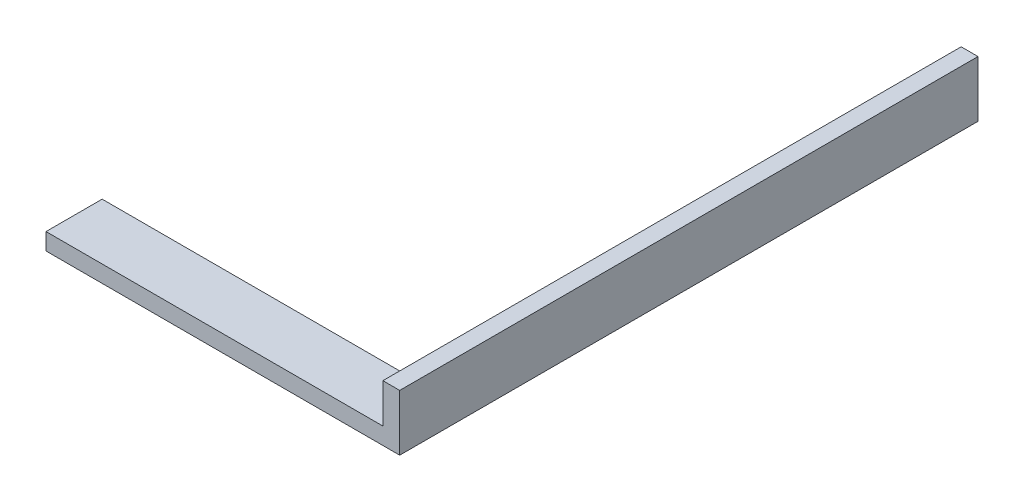
ISO-10303-21;
HEADER;
FILE_DESCRIPTION(('STEP AP214'),'2;1');
FILE_NAME('part.step','',(''),(''),'','','');
FILE_SCHEMA(('AUTOMOTIVE_DESIGN { 1 0 10303 214 1 1 1 1 }'));
ENDSEC;
DATA;
#1=APPLICATION_CONTEXT('core data for automotive mechanical design processes');
#2=APPLICATION_PROTOCOL_DEFINITION('international standard','automotive_design',2000,#1);
#3=PRODUCT_CONTEXT('',#1,'mechanical');
#4=PRODUCT('Part','Part','',(#3));
#5=PRODUCT_RELATED_PRODUCT_CATEGORY('part','',(#4));
#6=PRODUCT_DEFINITION_FORMATION('','',#4);
#7=PRODUCT_DEFINITION_CONTEXT('part definition',#1,'design');
#8=PRODUCT_DEFINITION('design','',#6,#7);
#9=PRODUCT_DEFINITION_SHAPE('','',#8);
#10=(LENGTH_UNIT() NAMED_UNIT(*) SI_UNIT(.MILLI.,.METRE.));
#11=(NAMED_UNIT(*) PLANE_ANGLE_UNIT() SI_UNIT($,.RADIAN.));
#12=(NAMED_UNIT(*) SI_UNIT($,.STERADIAN.) SOLID_ANGLE_UNIT());
#13=UNCERTAINTY_MEASURE_WITH_UNIT(LENGTH_MEASURE(1.E-05),#10,'distance_accuracy_value','');
#14=(GEOMETRIC_REPRESENTATION_CONTEXT(3) GLOBAL_UNCERTAINTY_ASSIGNED_CONTEXT((#13)) GLOBAL_UNIT_ASSIGNED_CONTEXT((#10,
#11,#12)) REPRESENTATION_CONTEXT('',''));
#15=CARTESIAN_POINT('',(0.,0.,0.));
#16=DIRECTION('',(0.,0.,1.));
#17=DIRECTION('',(1.,0.,0.));
#18=AXIS2_PLACEMENT_3D('',#15,#16,#17);
#19=CARTESIAN_POINT('',(-31.5,2.,-5.));
#20=DIRECTION('',(0.,0.,1.));
#21=DIRECTION('',(1.,0.,0.));
#22=AXIS2_PLACEMENT_3D('',#19,#20,#21);
#23=PLANE('',#22);
#24=DIRECTION('',(0.,1.,0.));
#25=VECTOR('',#24,1.);
#26=CARTESIAN_POINT('',(28.5,0.,-5.));
#27=LINE('',#26,#25);
#28=CARTESIAN_POINT('',(28.5,0.,-5.));
#29=VERTEX_POINT('',#28);
#30=CARTESIAN_POINT('',(28.5,3.,-5.));
#31=VERTEX_POINT('',#30);
#32=EDGE_CURVE('E61',#29,#31,#27,.T.);
#33=ORIENTED_EDGE('',*,*,#32,.F.);
#34=DIRECTION('',(-1.,0.,0.));
#35=VECTOR('',#34,1.);
#36=CARTESIAN_POINT('',(-31.5,0.,-5.));
#37=LINE('',#36,#35);
#38=CARTESIAN_POINT('',(-31.5,0.,-5.));
#39=VERTEX_POINT('',#38);
#40=EDGE_CURVE('E147',#29,#39,#37,.T.);
#41=ORIENTED_EDGE('',*,*,#40,.T.);
#42=DIRECTION('',(0.,-1.,0.));
#43=VECTOR('',#42,1.);
#44=CARTESIAN_POINT('',(-31.5,2.,-5.));
#45=LINE('',#44,#43);
#46=CARTESIAN_POINT('',(-31.5,3.,-5.));
#47=VERTEX_POINT('',#46);
#48=EDGE_CURVE('E11',#47,#39,#45,.T.);
#49=ORIENTED_EDGE('',*,*,#48,.F.);
#50=DIRECTION('',(-1.,0.,0.));
#51=VECTOR('',#50,1.);
#52=CARTESIAN_POINT('',(29.5,3.,-5.));
#53=LINE('',#52,#51);
#54=EDGE_CURVE('E133',#31,#47,#53,.T.);
#55=ORIENTED_EDGE('',*,*,#54,.F.);
#56=EDGE_LOOP('',(#33,#41,#49,#55));
#57=FACE_BOUND('',#56,.T.);
#58=ADVANCED_FACE('F45',(#57),#23,.F.);
#59=CARTESIAN_POINT('',(31.5,2.,5.));
#60=DIRECTION('',(-1.,0.,0.));
#61=DIRECTION('',(0.,0.,1.));
#62=AXIS2_PLACEMENT_3D('',#59,#60,#61);
#63=PLANE('',#62);
#64=DIRECTION('',(0.,0.,1.));
#65=VECTOR('',#64,1.);
#66=CARTESIAN_POINT('',(31.5,10.,-98.));
#67=LINE('',#66,#65);
#68=CARTESIAN_POINT('',(31.5,10.,-98.));
#69=VERTEX_POINT('',#68);
#70=CARTESIAN_POINT('',(31.5,9.99999999999999,5.));
#71=VERTEX_POINT('',#70);
#72=EDGE_CURVE('E117',#69,#71,#67,.T.);
#73=ORIENTED_EDGE('',*,*,#72,.T.);
#74=DIRECTION('',(0.,-1.,0.));
#75=VECTOR('',#74,1.);
#76=CARTESIAN_POINT('',(31.5,2.,5.));
#77=LINE('',#76,#75);
#78=CARTESIAN_POINT('',(31.5,0.,5.));
#79=VERTEX_POINT('',#78);
#80=EDGE_CURVE('E69',#71,#79,#77,.T.);
#81=ORIENTED_EDGE('',*,*,#80,.T.);
#82=DIRECTION('',(0.,0.,-1.));
#83=VECTOR('',#82,1.);
#84=CARTESIAN_POINT('',(31.5,0.,5.));
#85=LINE('',#84,#83);
#86=CARTESIAN_POINT('',(31.5,0.,-98.));
#87=VERTEX_POINT('',#86);
#88=EDGE_CURVE('E144',#79,#87,#85,.T.);
#89=ORIENTED_EDGE('',*,*,#88,.T.);
#90=DIRECTION('',(0.,-1.,0.));
#91=VECTOR('',#90,1.);
#92=CARTESIAN_POINT('',(31.5,0.,-98.));
#93=LINE('',#92,#91);
#94=EDGE_CURVE('E172',#69,#87,#93,.T.);
#95=ORIENTED_EDGE('',*,*,#94,.F.);
#96=EDGE_LOOP('',(#73,#81,#89,#95));
#97=FACE_BOUND('',#96,.T.);
#98=ADVANCED_FACE('F47',(#97),#63,.F.);
#99=CARTESIAN_POINT('',(-31.5,2.,5.));
#100=DIRECTION('',(1.,0.,0.));
#101=DIRECTION('',(0.,0.,-1.));
#102=AXIS2_PLACEMENT_3D('',#99,#100,#101);
#103=PLANE('',#102);
#104=DIRECTION('',(0.,0.,1.));
#105=VECTOR('',#104,1.);
#106=CARTESIAN_POINT('',(-31.5,0.,5.));
#107=LINE('',#106,#105);
#108=CARTESIAN_POINT('',(-31.5,0.,5.));
#109=VERTEX_POINT('',#108);
#110=EDGE_CURVE('E150',#39,#109,#107,.T.);
#111=ORIENTED_EDGE('',*,*,#110,.T.);
#112=DIRECTION('',(0.,-1.,0.));
#113=VECTOR('',#112,1.);
#114=CARTESIAN_POINT('',(-31.5,2.,5.));
#115=LINE('',#114,#113);
#116=CARTESIAN_POINT('',(-31.5,3.,5.));
#117=VERTEX_POINT('',#116);
#118=EDGE_CURVE('E54',#117,#109,#115,.T.);
#119=ORIENTED_EDGE('',*,*,#118,.F.);
#120=DIRECTION('',(0.,0.,1.));
#121=VECTOR('',#120,1.);
#122=CARTESIAN_POINT('',(-31.5,3.,-5.));
#123=LINE('',#122,#121);
#124=EDGE_CURVE('E140',#47,#117,#123,.T.);
#125=ORIENTED_EDGE('',*,*,#124,.F.);
#126=ORIENTED_EDGE('',*,*,#48,.T.);
#127=EDGE_LOOP('',(#111,#119,#125,#126));
#128=FACE_BOUND('',#127,.T.);
#129=ADVANCED_FACE('F193',(#128),#103,.F.);
#130=CARTESIAN_POINT('',(-31.5,2.,5.));
#131=DIRECTION('',(0.,0.,-1.));
#132=DIRECTION('',(-1.,0.,0.));
#133=AXIS2_PLACEMENT_3D('',#130,#131,#132);
#134=PLANE('',#133);
#135=ORIENTED_EDGE('',*,*,#80,.F.);
#136=DIRECTION('',(-1.,0.,0.));
#137=VECTOR('',#136,1.);
#138=CARTESIAN_POINT('',(-31.5,9.99999999999999,5.));
#139=LINE('',#138,#137);
#140=CARTESIAN_POINT('',(28.5,9.99999999999999,5.));
#141=VERTEX_POINT('',#140);
#142=EDGE_CURVE('E111',#71,#141,#139,.T.);
#143=ORIENTED_EDGE('',*,*,#142,.T.);
#144=DIRECTION('',(0.,1.,0.));
#145=VECTOR('',#144,1.);
#146=CARTESIAN_POINT('',(28.5,3.00000000000003,5.));
#147=LINE('',#146,#145);
#148=CARTESIAN_POINT('',(28.5,3.00000000000003,5.));
#149=VERTEX_POINT('',#148);
#150=EDGE_CURVE('E123',#149,#141,#147,.T.);
#151=ORIENTED_EDGE('',*,*,#150,.F.);
#152=DIRECTION('',(1.,0.,0.));
#153=VECTOR('',#152,1.);
#154=CARTESIAN_POINT('',(-31.5,3.,5.));
#155=LINE('',#154,#153);
#156=EDGE_CURVE('E129',#117,#149,#155,.T.);
#157=ORIENTED_EDGE('',*,*,#156,.F.);
#158=ORIENTED_EDGE('',*,*,#118,.T.);
#159=DIRECTION('',(1.,0.,0.));
#160=VECTOR('',#159,1.);
#161=CARTESIAN_POINT('',(-31.5,0.,5.));
#162=LINE('',#161,#160);
#163=EDGE_CURVE('E153',#109,#79,#162,.T.);
#164=ORIENTED_EDGE('',*,*,#163,.T.);
#165=EDGE_LOOP('',(#135,#143,#151,#157,#158,#164));
#166=FACE_BOUND('',#165,.T.);
#167=ADVANCED_FACE('F121',(#166),#134,.F.);
#168=CARTESIAN_POINT('',(0.,0.,0.));
#169=DIRECTION('',(0.,-1.,0.));
#170=DIRECTION('',(0.,0.,-1.));
#171=AXIS2_PLACEMENT_3D('',#168,#169,#170);
#172=PLANE('',#171);
#173=ORIENTED_EDGE('',*,*,#88,.F.);
#174=ORIENTED_EDGE('',*,*,#163,.F.);
#175=ORIENTED_EDGE('',*,*,#110,.F.);
#176=ORIENTED_EDGE('',*,*,#40,.F.);
#177=DIRECTION('',(0.,0.,1.));
#178=VECTOR('',#177,1.);
#179=CARTESIAN_POINT('',(28.5,0.,-98.));
#180=LINE('',#179,#178);
#181=CARTESIAN_POINT('',(28.5,0.,-98.));
#182=VERTEX_POINT('',#181);
#183=EDGE_CURVE('E116',#182,#29,#180,.T.);
#184=ORIENTED_EDGE('',*,*,#183,.F.);
#185=DIRECTION('',(-1.,0.,0.));
#186=VECTOR('',#185,1.);
#187=CARTESIAN_POINT('',(31.5,0.,-98.));
#188=LINE('',#187,#186);
#189=EDGE_CURVE('E169',#87,#182,#188,.T.);
#190=ORIENTED_EDGE('',*,*,#189,.F.);
#191=EDGE_LOOP('',(#173,#174,#175,#176,#184,#190));
#192=FACE_BOUND('',#191,.T.);
#193=ADVANCED_FACE('F165',(#192),#172,.T.);
#194=CARTESIAN_POINT('',(0.,3.,0.));
#195=DIRECTION('',(0.,1.,0.));
#196=DIRECTION('',(0.,0.,1.));
#197=AXIS2_PLACEMENT_3D('',#194,#195,#196);
#198=PLANE('',#197);
#199=DIRECTION('',(0.,0.,1.));
#200=VECTOR('',#199,1.);
#201=CARTESIAN_POINT('',(28.5,3.,-5.));
#202=LINE('',#201,#200);
#203=EDGE_CURVE('E127',#31,#149,#202,.T.);
#204=ORIENTED_EDGE('',*,*,#203,.F.);
#205=ORIENTED_EDGE('',*,*,#54,.T.);
#206=ORIENTED_EDGE('',*,*,#124,.T.);
#207=ORIENTED_EDGE('',*,*,#156,.T.);
#208=EDGE_LOOP('',(#204,#205,#206,#207));
#209=FACE_BOUND('',#208,.T.);
#210=ADVANCED_FACE('F192',(#209),#198,.T.);
#211=CARTESIAN_POINT('',(28.5,0.,0.));
#212=DIRECTION('',(-1.,0.,0.));
#213=DIRECTION('',(0.,0.,1.));
#214=AXIS2_PLACEMENT_3D('',#211,#212,#213);
#215=PLANE('',#214);
#216=ORIENTED_EDGE('',*,*,#150,.T.);
#217=DIRECTION('',(0.,0.,1.));
#218=VECTOR('',#217,1.);
#219=CARTESIAN_POINT('',(28.5,9.99999999999999,-98.));
#220=LINE('',#219,#218);
#221=CARTESIAN_POINT('',(28.5,9.99999999999999,-98.));
#222=VERTEX_POINT('',#221);
#223=EDGE_CURVE('E107',#222,#141,#220,.T.);
#224=ORIENTED_EDGE('',*,*,#223,.F.);
#225=DIRECTION('',(0.,1.,0.));
#226=VECTOR('',#225,1.);
#227=CARTESIAN_POINT('',(28.5,0.,-98.));
#228=LINE('',#227,#226);
#229=EDGE_CURVE('E178',#182,#222,#228,.T.);
#230=ORIENTED_EDGE('',*,*,#229,.F.);
#231=ORIENTED_EDGE('',*,*,#183,.T.);
#232=ORIENTED_EDGE('',*,*,#32,.T.);
#233=ORIENTED_EDGE('',*,*,#203,.T.);
#234=EDGE_LOOP('',(#216,#224,#230,#231,#232,#233));
#235=FACE_BOUND('',#234,.T.);
#236=ADVANCED_FACE('F126',(#235),#215,.T.);
#237=CARTESIAN_POINT('',(31.5,10.,-98.));
#238=DIRECTION('',(0.,-1.,0.));
#239=DIRECTION('',(1.,0.,0.));
#240=AXIS2_PLACEMENT_3D('',#237,#238,#239);
#241=PLANE('',#240);
#242=ORIENTED_EDGE('',*,*,#223,.T.);
#243=ORIENTED_EDGE('',*,*,#142,.F.);
#244=ORIENTED_EDGE('',*,*,#72,.F.);
#245=DIRECTION('',(1.,0.,0.));
#246=VECTOR('',#245,1.);
#247=CARTESIAN_POINT('',(31.5,10.,-98.));
#248=LINE('',#247,#246);
#249=EDGE_CURVE('E112',#222,#69,#248,.T.);
#250=ORIENTED_EDGE('',*,*,#249,.F.);
#251=EDGE_LOOP('',(#242,#243,#244,#250));
#252=FACE_BOUND('',#251,.T.);
#253=ADVANCED_FACE('F109',(#252),#241,.F.);
#254=CARTESIAN_POINT('',(0.,0.,-98.));
#255=DIRECTION('',(0.,0.,1.));
#256=DIRECTION('',(1.,0.,0.));
#257=AXIS2_PLACEMENT_3D('',#254,#255,#256);
#258=PLANE('',#257);
#259=ORIENTED_EDGE('',*,*,#94,.T.);
#260=ORIENTED_EDGE('',*,*,#189,.T.);
#261=ORIENTED_EDGE('',*,*,#229,.T.);
#262=ORIENTED_EDGE('',*,*,#249,.T.);
#263=EDGE_LOOP('',(#259,#260,#261,#262));
#264=FACE_BOUND('',#263,.T.);
#265=ADVANCED_FACE('F227',(#264),#258,.F.);
#266=CLOSED_SHELL('',(#58,#98,#129,#167,#193,#210,#236,#253,#265));
#267=MANIFOLD_SOLID_BREP('B2',#266);
#268=ADVANCED_BREP_SHAPE_REPRESENTATION('',(#18,#267),#14);
#269=SHAPE_DEFINITION_REPRESENTATION(#9,#268);
ENDSEC;
END-ISO-10303-21;
